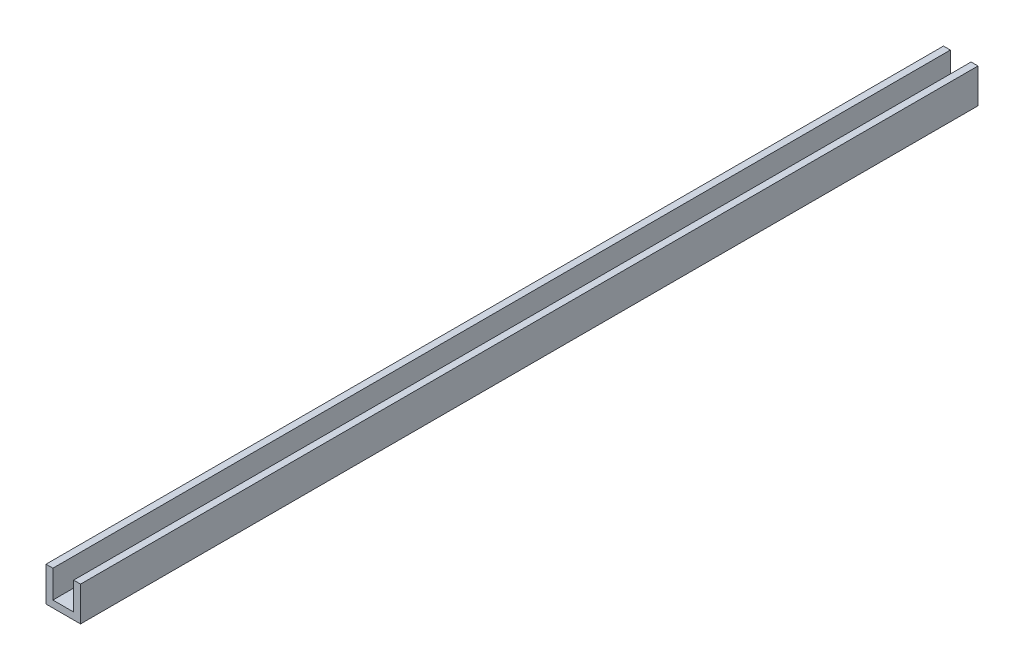
ISO-10303-21;
HEADER;
FILE_DESCRIPTION(('STEP AP214'),'2;1');
FILE_NAME('part.step','',(''),(''),'','','');
FILE_SCHEMA(('AUTOMOTIVE_DESIGN { 1 0 10303 214 1 1 1 1 }'));
ENDSEC;
DATA;
#1=APPLICATION_CONTEXT('core data for automotive mechanical design processes');
#2=APPLICATION_PROTOCOL_DEFINITION('international standard','automotive_design',2000,#1);
#3=PRODUCT_CONTEXT('',#1,'mechanical');
#4=PRODUCT('Part','Part','',(#3));
#5=PRODUCT_RELATED_PRODUCT_CATEGORY('part','',(#4));
#6=PRODUCT_DEFINITION_FORMATION('','',#4);
#7=PRODUCT_DEFINITION_CONTEXT('part definition',#1,'design');
#8=PRODUCT_DEFINITION('design','',#6,#7);
#9=PRODUCT_DEFINITION_SHAPE('','',#8);
#10=(LENGTH_UNIT() NAMED_UNIT(*) SI_UNIT(.MILLI.,.METRE.));
#11=(NAMED_UNIT(*) PLANE_ANGLE_UNIT() SI_UNIT($,.RADIAN.));
#12=(NAMED_UNIT(*) SI_UNIT($,.STERADIAN.) SOLID_ANGLE_UNIT());
#13=UNCERTAINTY_MEASURE_WITH_UNIT(LENGTH_MEASURE(1.E-05),#10,'distance_accuracy_value','');
#14=(GEOMETRIC_REPRESENTATION_CONTEXT(3) GLOBAL_UNCERTAINTY_ASSIGNED_CONTEXT((#13)) GLOBAL_UNIT_ASSIGNED_CONTEXT((#10,
#11,#12)) REPRESENTATION_CONTEXT('',''));
#15=CARTESIAN_POINT('',(0.,0.,0.));
#16=DIRECTION('',(0.,0.,1.));
#17=DIRECTION('',(1.,0.,0.));
#18=AXIS2_PLACEMENT_3D('',#15,#16,#17);
#19=CARTESIAN_POINT('',(2.,0.,260.));
#20=DIRECTION('',(0.,-1.,0.));
#21=DIRECTION('',(1.,0.,0.));
#22=AXIS2_PLACEMENT_3D('',#19,#20,#21);
#23=PLANE('',#22);
#24=DIRECTION('',(-1.,0.,0.));
#25=VECTOR('',#24,1.);
#26=CARTESIAN_POINT('',(2.,0.,0.));
#27=LINE('',#26,#25);
#28=CARTESIAN_POINT('',(2.,0.,0.));
#29=VERTEX_POINT('',#28);
#30=CARTESIAN_POINT('',(0.,0.,0.));
#31=VERTEX_POINT('',#30);
#32=EDGE_CURVE('E131',#29,#31,#27,.T.);
#33=ORIENTED_EDGE('',*,*,#32,.T.);
#34=DIRECTION('',(0.,0.,-1.));
#35=VECTOR('',#34,1.);
#36=CARTESIAN_POINT('',(0.,0.,260.));
#37=LINE('',#36,#35);
#38=CARTESIAN_POINT('',(0.,0.,260.));
#39=VERTEX_POINT('',#38);
#40=EDGE_CURVE('E11',#39,#31,#37,.T.);
#41=ORIENTED_EDGE('',*,*,#40,.F.);
#42=DIRECTION('',(-1.,0.,0.));
#43=VECTOR('',#42,1.);
#44=CARTESIAN_POINT('',(2.,0.,260.));
#45=LINE('',#44,#43);
#46=CARTESIAN_POINT('',(2.,0.,260.));
#47=VERTEX_POINT('',#46);
#48=EDGE_CURVE('E146',#47,#39,#45,.T.);
#49=ORIENTED_EDGE('',*,*,#48,.F.);
#50=DIRECTION('',(0.,0.,-1.));
#51=VECTOR('',#50,1.);
#52=CARTESIAN_POINT('',(2.,0.,260.));
#53=LINE('',#52,#51);
#54=EDGE_CURVE('E127',#47,#29,#53,.T.);
#55=ORIENTED_EDGE('',*,*,#54,.T.);
#56=EDGE_LOOP('',(#33,#41,#49,#55));
#57=FACE_BOUND('',#56,.T.);
#58=ADVANCED_FACE('F33',(#57),#23,.F.);
#59=CARTESIAN_POINT('',(0.,0.,260.));
#60=DIRECTION('',(1.,0.,0.));
#61=DIRECTION('',(0.,1.,0.));
#62=AXIS2_PLACEMENT_3D('',#59,#60,#61);
#63=PLANE('',#62);
#64=DIRECTION('',(0.,-1.,0.));
#65=VECTOR('',#64,1.);
#66=CARTESIAN_POINT('',(0.,0.,0.));
#67=LINE('',#66,#65);
#68=CARTESIAN_POINT('',(0.,-10.,0.));
#69=VERTEX_POINT('',#68);
#70=EDGE_CURVE('E134',#31,#69,#67,.T.);
#71=ORIENTED_EDGE('',*,*,#70,.T.);
#72=DIRECTION('',(0.,0.,-1.));
#73=VECTOR('',#72,1.);
#74=CARTESIAN_POINT('',(0.,-10.,260.));
#75=LINE('',#74,#73);
#76=CARTESIAN_POINT('',(0.,-10.,260.));
#77=VERTEX_POINT('',#76);
#78=EDGE_CURVE('E42',#77,#69,#75,.T.);
#79=ORIENTED_EDGE('',*,*,#78,.F.);
#80=DIRECTION('',(0.,-1.,0.));
#81=VECTOR('',#80,1.);
#82=CARTESIAN_POINT('',(0.,0.,260.));
#83=LINE('',#82,#81);
#84=EDGE_CURVE('E94',#39,#77,#83,.T.);
#85=ORIENTED_EDGE('',*,*,#84,.F.);
#86=ORIENTED_EDGE('',*,*,#40,.T.);
#87=EDGE_LOOP('',(#71,#79,#85,#86));
#88=FACE_BOUND('',#87,.T.);
#89=ADVANCED_FACE('F209',(#88),#63,.F.);
#90=CARTESIAN_POINT('',(0.,-10.,260.));
#91=DIRECTION('',(0.,1.,0.));
#92=DIRECTION('',(0.,0.,1.));
#93=AXIS2_PLACEMENT_3D('',#90,#91,#92);
#94=PLANE('',#93);
#95=CARTESIAN_POINT('',(5.,-10.,55.));
#96=DIRECTION('',(0.,-1.,0.));
#97=DIRECTION('',(0.,0.,-1.));
#98=AXIS2_PLACEMENT_3D('',#95,#96,#97);
#99=CIRCLE('',#98,1.25);
#100=CARTESIAN_POINT('',(5.,-10.,53.75));
#101=VERTEX_POINT('',#100);
#102=EDGE_CURVE('E172',#101,#101,#99,.T.);
#103=ORIENTED_EDGE('',*,*,#102,.F.);
#104=EDGE_LOOP('',(#103));
#105=FACE_BOUND('',#104,.T.);
#106=CARTESIAN_POINT('',(5.,-10.,5.));
#107=DIRECTION('',(0.,-1.,0.));
#108=DIRECTION('',(0.,0.,-1.));
#109=AXIS2_PLACEMENT_3D('',#106,#107,#108);
#110=CIRCLE('',#109,1.25);
#111=CARTESIAN_POINT('',(5.,-10.,3.75));
#112=VERTEX_POINT('',#111);
#113=EDGE_CURVE('E162',#112,#112,#110,.T.);
#114=ORIENTED_EDGE('',*,*,#113,.F.);
#115=EDGE_LOOP('',(#114));
#116=FACE_BOUND('',#115,.T.);
#117=CARTESIAN_POINT('',(5.,-10.,214.21));
#118=DIRECTION('',(0.,-1.,0.));
#119=DIRECTION('',(0.,0.,-1.));
#120=AXIS2_PLACEMENT_3D('',#117,#118,#119);
#121=CIRCLE('',#120,1.25);
#122=CARTESIAN_POINT('',(5.,-10.,212.96));
#123=VERTEX_POINT('',#122);
#124=EDGE_CURVE('E159',#123,#123,#121,.T.);
#125=ORIENTED_EDGE('',*,*,#124,.F.);
#126=EDGE_LOOP('',(#125));
#127=FACE_BOUND('',#126,.T.);
#128=DIRECTION('',(1.,0.,0.));
#129=VECTOR('',#128,1.);
#130=CARTESIAN_POINT('',(0.,-10.,0.));
#131=LINE('',#130,#129);
#132=CARTESIAN_POINT('',(10.,-10.,0.));
#133=VERTEX_POINT('',#132);
#134=EDGE_CURVE('E137',#69,#133,#131,.T.);
#135=ORIENTED_EDGE('',*,*,#134,.T.);
#136=DIRECTION('',(0.,0.,-1.));
#137=VECTOR('',#136,1.);
#138=CARTESIAN_POINT('',(10.,-10.,260.));
#139=LINE('',#138,#137);
#140=CARTESIAN_POINT('',(10.,-10.,260.));
#141=VERTEX_POINT('',#140);
#142=EDGE_CURVE('E153',#141,#133,#139,.T.);
#143=ORIENTED_EDGE('',*,*,#142,.F.);
#144=DIRECTION('',(1.,0.,0.));
#145=VECTOR('',#144,1.);
#146=CARTESIAN_POINT('',(0.,-10.,260.));
#147=LINE('',#146,#145);
#148=EDGE_CURVE('E177',#77,#141,#147,.T.);
#149=ORIENTED_EDGE('',*,*,#148,.F.);
#150=ORIENTED_EDGE('',*,*,#78,.T.);
#151=EDGE_LOOP('',(#135,#143,#149,#150));
#152=FACE_BOUND('',#151,.T.);
#153=ADVANCED_FACE('F213',(#105,#116,#127,#152),#94,.F.);
#154=CARTESIAN_POINT('',(10.,-10.,260.));
#155=DIRECTION('',(-1.,0.,0.));
#156=DIRECTION('',(0.,0.,1.));
#157=AXIS2_PLACEMENT_3D('',#154,#155,#156);
#158=PLANE('',#157);
#159=DIRECTION('',(0.,1.,0.));
#160=VECTOR('',#159,1.);
#161=CARTESIAN_POINT('',(10.,-10.,0.));
#162=LINE('',#161,#160);
#163=CARTESIAN_POINT('',(10.,0.,0.));
#164=VERTEX_POINT('',#163);
#165=EDGE_CURVE('E139',#133,#164,#162,.T.);
#166=ORIENTED_EDGE('',*,*,#165,.T.);
#167=DIRECTION('',(0.,0.,-1.));
#168=VECTOR('',#167,1.);
#169=CARTESIAN_POINT('',(10.,0.,260.));
#170=LINE('',#169,#168);
#171=CARTESIAN_POINT('',(10.,0.,260.));
#172=VERTEX_POINT('',#171);
#173=EDGE_CURVE('E150',#172,#164,#170,.T.);
#174=ORIENTED_EDGE('',*,*,#173,.F.);
#175=DIRECTION('',(0.,1.,0.));
#176=VECTOR('',#175,1.);
#177=CARTESIAN_POINT('',(10.,-10.,260.));
#178=LINE('',#177,#176);
#179=EDGE_CURVE('E179',#141,#172,#178,.T.);
#180=ORIENTED_EDGE('',*,*,#179,.F.);
#181=ORIENTED_EDGE('',*,*,#142,.T.);
#182=EDGE_LOOP('',(#166,#174,#180,#181));
#183=FACE_BOUND('',#182,.T.);
#184=ADVANCED_FACE('F185',(#183),#158,.F.);
#185=CARTESIAN_POINT('',(10.,0.,260.));
#186=DIRECTION('',(0.,-1.,0.));
#187=DIRECTION('',(1.,0.,0.));
#188=AXIS2_PLACEMENT_3D('',#185,#186,#187);
#189=PLANE('',#188);
#190=DIRECTION('',(-1.,0.,0.));
#191=VECTOR('',#190,1.);
#192=CARTESIAN_POINT('',(10.,0.,0.));
#193=LINE('',#192,#191);
#194=CARTESIAN_POINT('',(8.,0.,0.));
#195=VERTEX_POINT('',#194);
#196=EDGE_CURVE('E141',#164,#195,#193,.T.);
#197=ORIENTED_EDGE('',*,*,#196,.T.);
#198=DIRECTION('',(0.,0.,-1.));
#199=VECTOR('',#198,1.);
#200=CARTESIAN_POINT('',(8.,0.,260.));
#201=LINE('',#200,#199);
#202=CARTESIAN_POINT('',(8.,0.,260.));
#203=VERTEX_POINT('',#202);
#204=EDGE_CURVE('E122',#203,#195,#201,.T.);
#205=ORIENTED_EDGE('',*,*,#204,.F.);
#206=DIRECTION('',(-1.,0.,0.));
#207=VECTOR('',#206,1.);
#208=CARTESIAN_POINT('',(10.,0.,260.));
#209=LINE('',#208,#207);
#210=EDGE_CURVE('E113',#172,#203,#209,.T.);
#211=ORIENTED_EDGE('',*,*,#210,.F.);
#212=ORIENTED_EDGE('',*,*,#173,.T.);
#213=EDGE_LOOP('',(#197,#205,#211,#212));
#214=FACE_BOUND('',#213,.T.);
#215=ADVANCED_FACE('F189',(#214),#189,.F.);
#216=CARTESIAN_POINT('',(8.,0.,260.));
#217=DIRECTION('',(1.,0.,0.));
#218=DIRECTION('',(0.,1.,0.));
#219=AXIS2_PLACEMENT_3D('',#216,#217,#218);
#220=PLANE('',#219);
#221=DIRECTION('',(0.,-1.,0.));
#222=VECTOR('',#221,1.);
#223=CARTESIAN_POINT('',(8.,0.,0.));
#224=LINE('',#223,#222);
#225=CARTESIAN_POINT('',(8.,-8.,0.));
#226=VERTEX_POINT('',#225);
#227=EDGE_CURVE('E121',#195,#226,#224,.T.);
#228=ORIENTED_EDGE('',*,*,#227,.T.);
#229=DIRECTION('',(0.,0.,-1.));
#230=VECTOR('',#229,1.);
#231=CARTESIAN_POINT('',(8.,-8.,260.));
#232=LINE('',#231,#230);
#233=CARTESIAN_POINT('',(8.,-8.,260.));
#234=VERTEX_POINT('',#233);
#235=EDGE_CURVE('E118',#234,#226,#232,.T.);
#236=ORIENTED_EDGE('',*,*,#235,.F.);
#237=DIRECTION('',(0.,-1.,0.));
#238=VECTOR('',#237,1.);
#239=CARTESIAN_POINT('',(8.,0.,260.));
#240=LINE('',#239,#238);
#241=EDGE_CURVE('E107',#203,#234,#240,.T.);
#242=ORIENTED_EDGE('',*,*,#241,.F.);
#243=ORIENTED_EDGE('',*,*,#204,.T.);
#244=EDGE_LOOP('',(#228,#236,#242,#243));
#245=FACE_BOUND('',#244,.T.);
#246=ADVANCED_FACE('F119',(#245),#220,.F.);
#247=CARTESIAN_POINT('',(8.,-8.,260.));
#248=DIRECTION('',(0.,-1.,0.));
#249=DIRECTION('',(0.,0.,-1.));
#250=AXIS2_PLACEMENT_3D('',#247,#248,#249);
#251=PLANE('',#250);
#252=CARTESIAN_POINT('',(5.,-8.,55.));
#253=DIRECTION('',(0.,-1.,0.));
#254=DIRECTION('',(0.,0.,-1.));
#255=AXIS2_PLACEMENT_3D('',#252,#253,#254);
#256=CIRCLE('',#255,1.25);
#257=CARTESIAN_POINT('',(5.,-8.,53.75));
#258=VERTEX_POINT('',#257);
#259=EDGE_CURVE('E36',#258,#258,#256,.T.);
#260=ORIENTED_EDGE('',*,*,#259,.T.);
#261=EDGE_LOOP('',(#260));
#262=FACE_BOUND('',#261,.T.);
#263=CARTESIAN_POINT('',(5.,-8.,5.));
#264=DIRECTION('',(0.,-1.,0.));
#265=DIRECTION('',(0.,0.,-1.));
#266=AXIS2_PLACEMENT_3D('',#263,#264,#265);
#267=CIRCLE('',#266,1.25);
#268=CARTESIAN_POINT('',(5.,-8.,3.75));
#269=VERTEX_POINT('',#268);
#270=EDGE_CURVE('E160',#269,#269,#267,.T.);
#271=ORIENTED_EDGE('',*,*,#270,.T.);
#272=EDGE_LOOP('',(#271));
#273=FACE_BOUND('',#272,.T.);
#274=CARTESIAN_POINT('',(5.,-8.,214.21));
#275=DIRECTION('',(0.,-1.,0.));
#276=DIRECTION('',(0.,0.,-1.));
#277=AXIS2_PLACEMENT_3D('',#274,#275,#276);
#278=CIRCLE('',#277,1.25);
#279=CARTESIAN_POINT('',(5.,-8.,212.96));
#280=VERTEX_POINT('',#279);
#281=EDGE_CURVE('E135',#280,#280,#278,.T.);
#282=ORIENTED_EDGE('',*,*,#281,.T.);
#283=EDGE_LOOP('',(#282));
#284=FACE_BOUND('',#283,.T.);
#285=DIRECTION('',(-1.,0.,0.));
#286=VECTOR('',#285,1.);
#287=CARTESIAN_POINT('',(8.,-8.,0.));
#288=LINE('',#287,#286);
#289=CARTESIAN_POINT('',(2.,-8.,0.));
#290=VERTEX_POINT('',#289);
#291=EDGE_CURVE('E80',#226,#290,#288,.T.);
#292=ORIENTED_EDGE('',*,*,#291,.T.);
#293=DIRECTION('',(0.,0.,-1.));
#294=VECTOR('',#293,1.);
#295=CARTESIAN_POINT('',(2.,-8.,260.));
#296=LINE('',#295,#294);
#297=CARTESIAN_POINT('',(2.,-8.,260.));
#298=VERTEX_POINT('',#297);
#299=EDGE_CURVE('E123',#298,#290,#296,.T.);
#300=ORIENTED_EDGE('',*,*,#299,.F.);
#301=DIRECTION('',(-1.,0.,0.));
#302=VECTOR('',#301,1.);
#303=CARTESIAN_POINT('',(8.,-8.,260.));
#304=LINE('',#303,#302);
#305=EDGE_CURVE('E111',#234,#298,#304,.T.);
#306=ORIENTED_EDGE('',*,*,#305,.F.);
#307=ORIENTED_EDGE('',*,*,#235,.T.);
#308=EDGE_LOOP('',(#292,#300,#306,#307));
#309=FACE_BOUND('',#308,.T.);
#310=ADVANCED_FACE('F125',(#262,#273,#284,#309),#251,.F.);
#311=CARTESIAN_POINT('',(2.,-8.,260.));
#312=DIRECTION('',(-1.,0.,0.));
#313=DIRECTION('',(0.,0.,1.));
#314=AXIS2_PLACEMENT_3D('',#311,#312,#313);
#315=PLANE('',#314);
#316=DIRECTION('',(0.,1.,0.));
#317=VECTOR('',#316,1.);
#318=CARTESIAN_POINT('',(2.,-8.,0.));
#319=LINE('',#318,#317);
#320=EDGE_CURVE('E86',#290,#29,#319,.T.);
#321=ORIENTED_EDGE('',*,*,#320,.T.);
#322=ORIENTED_EDGE('',*,*,#54,.F.);
#323=DIRECTION('',(0.,1.,0.));
#324=VECTOR('',#323,1.);
#325=CARTESIAN_POINT('',(2.,-8.,260.));
#326=LINE('',#325,#324);
#327=EDGE_CURVE('E51',#298,#47,#326,.T.);
#328=ORIENTED_EDGE('',*,*,#327,.F.);
#329=ORIENTED_EDGE('',*,*,#299,.T.);
#330=EDGE_LOOP('',(#321,#322,#328,#329));
#331=FACE_BOUND('',#330,.T.);
#332=ADVANCED_FACE('F197',(#331),#315,.F.);
#333=CARTESIAN_POINT('',(0.,0.,260.));
#334=DIRECTION('',(0.,0.,1.));
#335=DIRECTION('',(1.,0.,0.));
#336=AXIS2_PLACEMENT_3D('',#333,#334,#335);
#337=PLANE('',#336);
#338=ORIENTED_EDGE('',*,*,#48,.T.);
#339=ORIENTED_EDGE('',*,*,#84,.T.);
#340=ORIENTED_EDGE('',*,*,#148,.T.);
#341=ORIENTED_EDGE('',*,*,#179,.T.);
#342=ORIENTED_EDGE('',*,*,#210,.T.);
#343=ORIENTED_EDGE('',*,*,#241,.T.);
#344=ORIENTED_EDGE('',*,*,#305,.T.);
#345=ORIENTED_EDGE('',*,*,#327,.T.);
#346=EDGE_LOOP('',(#338,#339,#340,#341,#342,#343,#344,#345));
#347=FACE_BOUND('',#346,.T.);
#348=ADVANCED_FACE('F109',(#347),#337,.T.);
#349=CARTESIAN_POINT('',(0.,0.,0.));
#350=DIRECTION('',(0.,0.,1.));
#351=DIRECTION('',(1.,0.,0.));
#352=AXIS2_PLACEMENT_3D('',#349,#350,#351);
#353=PLANE('',#352);
#354=ORIENTED_EDGE('',*,*,#32,.F.);
#355=ORIENTED_EDGE('',*,*,#320,.F.);
#356=ORIENTED_EDGE('',*,*,#291,.F.);
#357=ORIENTED_EDGE('',*,*,#227,.F.);
#358=ORIENTED_EDGE('',*,*,#196,.F.);
#359=ORIENTED_EDGE('',*,*,#165,.F.);
#360=ORIENTED_EDGE('',*,*,#134,.F.);
#361=ORIENTED_EDGE('',*,*,#70,.F.);
#362=EDGE_LOOP('',(#354,#355,#356,#357,#358,#359,#360,#361));
#363=FACE_BOUND('',#362,.T.);
#364=ADVANCED_FACE('F192',(#363),#353,.F.);
#365=CARTESIAN_POINT('',(5.,0.,214.21));
#366=DIRECTION('',(0.,-1.,0.));
#367=DIRECTION('',(0.,0.,-1.));
#368=AXIS2_PLACEMENT_3D('',#365,#366,#367);
#369=CYLINDRICAL_SURFACE('',#368,1.25);
#370=ORIENTED_EDGE('',*,*,#124,.T.);
#371=EDGE_LOOP('',(#370));
#372=FACE_BOUND('',#371,.T.);
#373=ORIENTED_EDGE('',*,*,#281,.F.);
#374=EDGE_LOOP('',(#373));
#375=FACE_BOUND('',#374,.T.);
#376=ADVANCED_FACE('F249',(#372,#375),#369,.F.);
#377=CARTESIAN_POINT('',(5.,0.,5.));
#378=DIRECTION('',(0.,-1.,0.));
#379=DIRECTION('',(0.,0.,-1.));
#380=AXIS2_PLACEMENT_3D('',#377,#378,#379);
#381=CYLINDRICAL_SURFACE('',#380,1.25);
#382=ORIENTED_EDGE('',*,*,#113,.T.);
#383=EDGE_LOOP('',(#382));
#384=FACE_BOUND('',#383,.T.);
#385=ORIENTED_EDGE('',*,*,#270,.F.);
#386=EDGE_LOOP('',(#385));
#387=FACE_BOUND('',#386,.T.);
#388=ADVANCED_FACE('F243',(#384,#387),#381,.F.);
#389=CARTESIAN_POINT('',(5.,0.,55.));
#390=DIRECTION('',(0.,-1.,0.));
#391=DIRECTION('',(0.,0.,-1.));
#392=AXIS2_PLACEMENT_3D('',#389,#390,#391);
#393=CYLINDRICAL_SURFACE('',#392,1.25);
#394=ORIENTED_EDGE('',*,*,#102,.T.);
#395=EDGE_LOOP('',(#394));
#396=FACE_BOUND('',#395,.T.);
#397=ORIENTED_EDGE('',*,*,#259,.F.);
#398=EDGE_LOOP('',(#397));
#399=FACE_BOUND('',#398,.T.);
#400=ADVANCED_FACE('F248',(#396,#399),#393,.F.);
#401=CLOSED_SHELL('',(#58,#89,#153,#184,#215,#246,#310,#332,#348,#364,#376,#388,#400));
#402=MANIFOLD_SOLID_BREP('B2',#401);
#403=ADVANCED_BREP_SHAPE_REPRESENTATION('',(#18,#402),#14);
#404=SHAPE_DEFINITION_REPRESENTATION(#9,#403);
ENDSEC;
END-ISO-10303-21;
